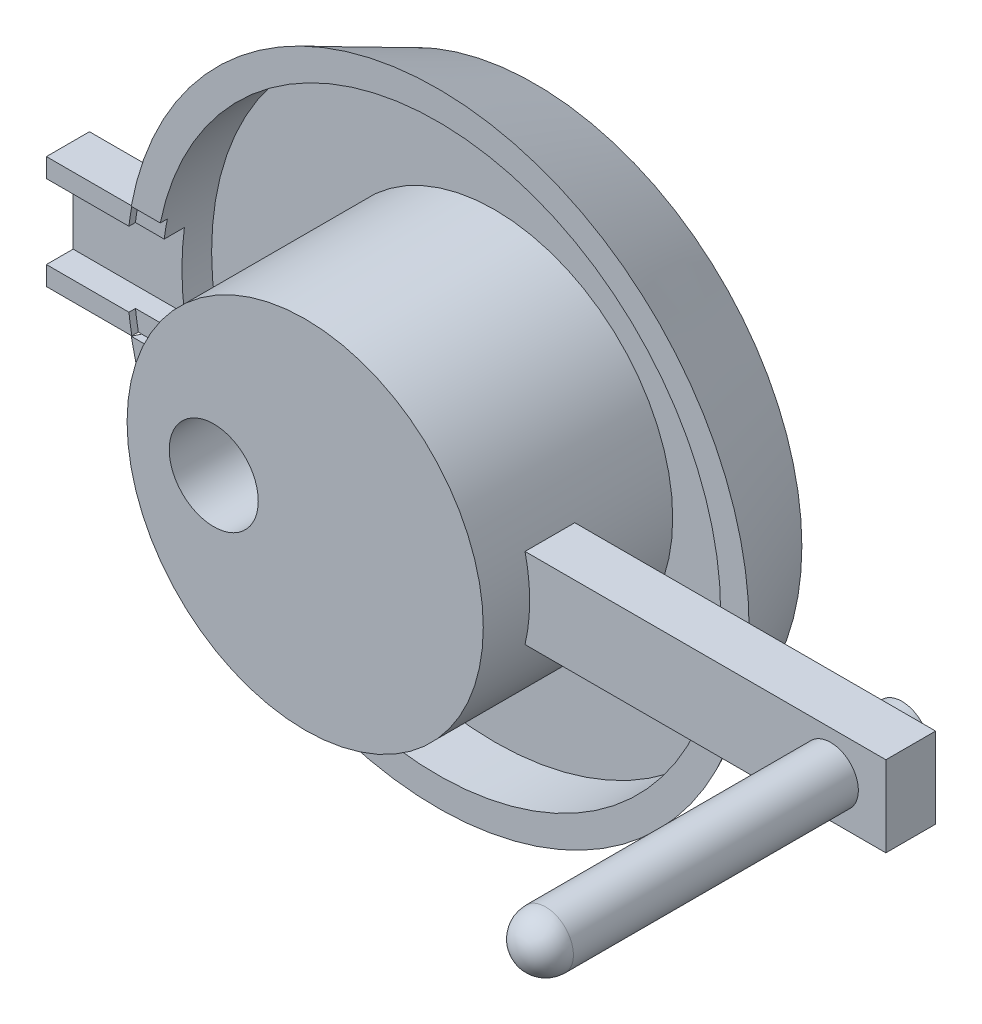
ISO-10303-21;
HEADER;
FILE_DESCRIPTION(('STEP AP214'),'2;1');
FILE_NAME('part.step','',(''),(''),'','','');
FILE_SCHEMA(('AUTOMOTIVE_DESIGN { 1 0 10303 214 1 1 1 1 }'));
ENDSEC;
DATA;
#1=APPLICATION_CONTEXT('core data for automotive mechanical design processes');
#2=APPLICATION_PROTOCOL_DEFINITION('international standard','automotive_design',2000,#1);
#3=PRODUCT_CONTEXT('',#1,'mechanical');
#4=PRODUCT('Part','Part','',(#3));
#5=PRODUCT_RELATED_PRODUCT_CATEGORY('part','',(#4));
#6=PRODUCT_DEFINITION_FORMATION('','',#4);
#7=PRODUCT_DEFINITION_CONTEXT('part definition',#1,'design');
#8=PRODUCT_DEFINITION('design','',#6,#7);
#9=PRODUCT_DEFINITION_SHAPE('','',#8);
#10=(LENGTH_UNIT() NAMED_UNIT(*) SI_UNIT(.MILLI.,.METRE.));
#11=(NAMED_UNIT(*) PLANE_ANGLE_UNIT() SI_UNIT($,.RADIAN.));
#12=(NAMED_UNIT(*) SI_UNIT($,.STERADIAN.) SOLID_ANGLE_UNIT());
#13=UNCERTAINTY_MEASURE_WITH_UNIT(LENGTH_MEASURE(1.E-05),#10,'distance_accuracy_value','');
#14=(GEOMETRIC_REPRESENTATION_CONTEXT(3) GLOBAL_UNCERTAINTY_ASSIGNED_CONTEXT((#13)) GLOBAL_UNIT_ASSIGNED_CONTEXT((#10,
#11,#12)) REPRESENTATION_CONTEXT('',''));
#15=CARTESIAN_POINT('',(0.,0.,0.));
#16=DIRECTION('',(0.,0.,1.));
#17=DIRECTION('',(1.,0.,0.));
#18=AXIS2_PLACEMENT_3D('',#15,#16,#17);
#19=CARTESIAN_POINT('',(-110.,15.8030060752015,-17.3472721621208));
#20=DIRECTION('',(0.,0.,-1.));
#21=DIRECTION('',(-1.,0.,0.));
#22=AXIS2_PLACEMENT_3D('',#19,#20,#21);
#23=PLANE('',#22);
#24=DIRECTION('',(1.,0.,0.));
#25=VECTOR('',#24,1.);
#26=CARTESIAN_POINT('',(-110.,10.4411316840622,-17.3472721621208));
#27=LINE('',#26,#25);
#28=CARTESIAN_POINT('',(-110.,10.4411316840622,-17.3472721621208));
#29=VERTEX_POINT('',#28);
#30=CARTESIAN_POINT('',(-86.8277278753882,10.4411316840622,-17.3472721621206));
#31=VERTEX_POINT('',#30);
#32=EDGE_CURVE('E369',#29,#31,#27,.T.);
#33=ORIENTED_EDGE('',*,*,#32,.T.);
#34=CARTESIAN_POINT('',(0.,0.,-17.34727216212));
#35=DIRECTION('',(0.,0.,-1.));
#36=DIRECTION('',(-1.,0.,0.));
#37=AXIS2_PLACEMENT_3D('',#34,#35,#36);
#38=CIRCLE('',#37,87.4532535635261);
#39=CARTESIAN_POINT('',(-86.0135835658155,15.8030060752015,-17.3472721621206));
#40=VERTEX_POINT('',#39);
#41=EDGE_CURVE('E249',#31,#40,#38,.T.);
#42=ORIENTED_EDGE('',*,*,#41,.T.);
#43=DIRECTION('',(1.,0.,0.));
#44=VECTOR('',#43,1.);
#45=CARTESIAN_POINT('',(-110.,15.8030060752015,-17.3472721621208));
#46=LINE('',#45,#44);
#47=CARTESIAN_POINT('',(-110.,15.8030060752015,-17.3472721621208));
#48=VERTEX_POINT('',#47);
#49=EDGE_CURVE('E423',#48,#40,#46,.T.);
#50=ORIENTED_EDGE('',*,*,#49,.F.);
#51=DIRECTION('',(0.,1.,0.));
#52=VECTOR('',#51,1.);
#53=CARTESIAN_POINT('',(-110.,15.8030060752015,-17.3472721621208));
#54=LINE('',#53,#52);
#55=EDGE_CURVE('E372',#29,#48,#54,.T.);
#56=ORIENTED_EDGE('',*,*,#55,.F.);
#57=EDGE_LOOP('',(#33,#42,#50,#56));
#58=FACE_BOUND('',#57,.T.);
#59=ADVANCED_FACE('F46',(#58),#23,.F.);
#60=CARTESIAN_POINT('',(0.,0.,-33.1783072477576));
#61=DIRECTION('',(0.,0.,1.));
#62=DIRECTION('',(1.,0.,0.));
#63=AXIS2_PLACEMENT_3D('',#60,#61,#62);
#64=CYLINDRICAL_SURFACE('',#63,79.4516873044254);
#65=CARTESIAN_POINT('',(0.,0.,-33.1783072477576));
#66=DIRECTION('',(0.,0.,1.));
#67=DIRECTION('',(1.,0.,0.));
#68=AXIS2_PLACEMENT_3D('',#65,#66,#67);
#69=CIRCLE('',#68,79.4516873044254);
#70=CARTESIAN_POINT('',(79.4516873044254,0.,-33.1783072477576));
#71=VERTEX_POINT('',#70);
#72=EDGE_CURVE('E432',#71,#71,#69,.T.);
#73=ORIENTED_EDGE('',*,*,#72,.F.);
#74=EDGE_LOOP('',(#73));
#75=FACE_BOUND('',#74,.T.);
#76=CARTESIAN_POINT('',(0.,0.,-19.1783072477576));
#77=DIRECTION('',(0.,0.,-1.));
#78=DIRECTION('',(1.,0.,0.));
#79=AXIS2_PLACEMENT_3D('',#76,#77,#78);
#80=CIRCLE('',#79,79.4516873044254);
#81=CARTESIAN_POINT('',(-77.863267306241,-15.8076633288115,-19.1783072477576));
#82=VERTEX_POINT('',#81);
#83=CARTESIAN_POINT('',(-78.7626395232934,-10.4411316840622,-19.1783072477576));
#84=VERTEX_POINT('',#83);
#85=EDGE_CURVE('E70',#82,#84,#80,.T.);
#86=ORIENTED_EDGE('',*,*,#85,.F.);
#87=DIRECTION('',(0.,0.,1.));
#88=VECTOR('',#87,1.);
#89=CARTESIAN_POINT('',(-77.863267306241,-15.8076633288115,-19.1783072477576));
#90=LINE('',#89,#88);
#91=CARTESIAN_POINT('',(-77.863267306241,-15.8076633288115,-17.1783072477576));
#92=VERTEX_POINT('',#91);
#93=EDGE_CURVE('E193',#82,#92,#90,.T.);
#94=ORIENTED_EDGE('',*,*,#93,.T.);
#95=CARTESIAN_POINT('',(0.,0.,-17.1783072477576));
#96=DIRECTION('',(0.,0.,1.));
#97=DIRECTION('',(1.,0.,0.));
#98=AXIS2_PLACEMENT_3D('',#95,#96,#97);
#99=CIRCLE('',#98,79.4516873044254);
#100=CARTESIAN_POINT('',(-77.863267306241,15.8076633288116,-17.1783072477576));
#101=VERTEX_POINT('',#100);
#102=EDGE_CURVE('E426',#92,#101,#99,.T.);
#103=ORIENTED_EDGE('',*,*,#102,.T.);
#104=DIRECTION('',(0.,0.,1.));
#105=VECTOR('',#104,1.);
#106=CARTESIAN_POINT('',(-77.863267306241,15.8076633288116,-19.1783072477576));
#107=LINE('',#106,#105);
#108=CARTESIAN_POINT('',(-77.863267306241,15.8076633288116,-19.1783072477576));
#109=VERTEX_POINT('',#108);
#110=EDGE_CURVE('E201',#109,#101,#107,.T.);
#111=ORIENTED_EDGE('',*,*,#110,.F.);
#112=CARTESIAN_POINT('',(-78.7626395232934,10.4411316840622,-19.1783072477576));
#113=VERTEX_POINT('',#112);
#114=EDGE_CURVE('E190',#113,#109,#80,.T.);
#115=ORIENTED_EDGE('',*,*,#114,.F.);
#116=DIRECTION('',(0.,0.,1.));
#117=VECTOR('',#116,1.);
#118=CARTESIAN_POINT('',(-78.7626395232934,10.4411316840622,-33.1783072477576));
#119=LINE('',#118,#117);
#120=CARTESIAN_POINT('',(-78.7626395232934,10.4411316840622,-24.8504417891901));
#121=VERTEX_POINT('',#120);
#122=EDGE_CURVE('E391',#121,#113,#119,.T.);
#123=ORIENTED_EDGE('',*,*,#122,.F.);
#124=CARTESIAN_POINT('',(0.,0.,-24.8504417891895));
#125=DIRECTION('',(0.,0.,-1.));
#126=DIRECTION('',(-1.,0.,0.));
#127=AXIS2_PLACEMENT_3D('',#124,#125,#126);
#128=CIRCLE('',#127,79.4516873044254);
#129=CARTESIAN_POINT('',(-78.7626395232934,-10.4411316840622,-24.8504417891901));
#130=VERTEX_POINT('',#129);
#131=EDGE_CURVE('E403',#130,#121,#128,.T.);
#132=ORIENTED_EDGE('',*,*,#131,.F.);
#133=DIRECTION('',(0.,0.,1.));
#134=VECTOR('',#133,1.);
#135=CARTESIAN_POINT('',(-78.7626395232934,-10.4411316840622,-33.1783072477576));
#136=LINE('',#135,#134);
#137=EDGE_CURVE('E207',#84,#130,#136,.F.);
#138=ORIENTED_EDGE('',*,*,#137,.F.);
#139=EDGE_LOOP('',(#86,#94,#103,#111,#115,#123,#132,#138));
#140=FACE_BOUND('',#139,.T.);
#141=ADVANCED_FACE('F205',(#75,#140),#64,.F.);
#142=CARTESIAN_POINT('',(0.,0.,-17.1783072477576));
#143=DIRECTION('',(0.,0.,1.));
#144=DIRECTION('',(1.,0.,0.));
#145=AXIS2_PLACEMENT_3D('',#142,#143,#144);
#146=CONICAL_SURFACE('',#145,87.4532535635261,0.429347341361167);
#147=CARTESIAN_POINT('',(-81.1707916499562,-15.8076633288115,-27.5697947471287));
#148=CARTESIAN_POINT('',(-81.9006412330142,-15.8076633288115,-26.0050437343717));
#149=CARTESIAN_POINT('',(-82.6301969309398,-15.8076633288115,-24.4401556633716));
#150=CARTESIAN_POINT('',(-84.0887619982068,-15.8076633288115,-21.3101251342316));
#151=CARTESIAN_POINT('',(-84.8177713676055,-15.8076633288115,-19.7449826761185));
#152=CARTESIAN_POINT('',(-86.2752853621597,-15.8076633288115,-16.6144627962403));
#153=CARTESIAN_POINT('',(-87.0037899873223,-15.8076633288115,-15.0490853744785));
#154=CARTESIAN_POINT('',(-88.4603302018703,-15.8076633288115,-11.9181121318984));
#155=CARTESIAN_POINT('',(-89.1883657912064,-15.8076633288115,-10.352516311057));
#156=CARTESIAN_POINT('',(-89.9161846352235,-15.8076633288115,-8.78681974838652));
#157=B_SPLINE_CURVE_WITH_KNOTS('',3,(#147,#148,#149,#150,#151,#152,#153,#154,#155,#156),
.UNSPECIFIED.,.F.,.F.,(4,2,2,2,4),(0.,5.17978134078667,10.359562138167,15.5393428612142,
20.7191241275354),.UNSPECIFIED.);
#158=CARTESIAN_POINT('',(-85.0815633442139,-15.8076633288115,-19.1783072477576));
#159=VERTEX_POINT('',#158);
#160=CARTESIAN_POINT('',(-86.0127277728671,-15.8076633288115,-17.1783072477576));
#161=VERTEX_POINT('',#160);
#162=EDGE_CURVE('E257',#159,#161,#157,.T.);
#163=ORIENTED_EDGE('',*,*,#162,.F.);
#164=CARTESIAN_POINT('',(0.,0.,-19.1783072477576));
#165=DIRECTION('',(0.,0.,1.));
#166=DIRECTION('',(1.,0.,0.));
#167=AXIS2_PLACEMENT_3D('',#164,#165,#166);
#168=CIRCLE('',#167,86.5375909129237);
#169=CARTESIAN_POINT('',(-85.0824285031855,-15.8030060752015,-19.1783072477576));
#170=VERTEX_POINT('',#169);
#171=EDGE_CURVE('E186',#159,#170,#168,.F.);
#172=ORIENTED_EDGE('',*,*,#171,.T.);
#173=CARTESIAN_POINT('',(-99.8671215940255,-15.8030060752015,12.6503066753599));
#174=CARTESIAN_POINT('',(-98.4733748466682,-15.8030060752015,9.64348997213781));
#175=CARTESIAN_POINT('',(-97.0790477456083,-15.8030060752015,6.63694234804403));
#176=CARTESIAN_POINT('',(-94.2890578783447,-15.8030060752015,0.62446670157915));
#177=CARTESIAN_POINT('',(-92.8933951120654,-15.8030060752015,-2.38146132075677));
#178=CARTESIAN_POINT('',(-88.7041468476065,-15.8030060752015,-11.3981809719123));
#179=CARTESIAN_POINT('',(-85.9082956647367,-15.8030060752015,-17.4079205267518));
#180=CARTESIAN_POINT('',(-81.7084767017977,-15.8030060752015,-26.4197181841688));
#181=CARTESIAN_POINT('',(-80.3075291751193,-15.8030060752015,-29.4231839222923));
#182=CARTESIAN_POINT('',(-77.503270175861,-15.8030060752015,-35.4290113736298));
#183=CARTESIAN_POINT('',(-76.0999587035228,-15.8030060752015,-38.4313730869566));
#184=CARTESIAN_POINT('',(-73.2905632650009,-15.8030060752015,-44.4348065809532));
#185=CARTESIAN_POINT('',(-71.8844792933504,-15.8030060752015,-47.4358783590653));
#186=CARTESIAN_POINT('',(-69.068989364936,-15.8030060752015,-53.4364644450023));
#187=CARTESIAN_POINT('',(-67.6595834069583,-15.8030060752015,-56.4359787522577));
#188=CARTESIAN_POINT('',(-66.2482408429435,-15.8030060752015,-59.4345824232532));
#189=B_SPLINE_CURVE_WITH_KNOTS('',3,(#173,#174,#175,#176,#177,#178,#179,#180,#181,#182,#183,
#184,#185,#186,#187,#188),.UNSPECIFIED.,.F.,.F.,(4,2,2,2,2,2,2,4),(0.,9.94239837863744,
19.8847973215241,39.7695543996393,49.7119448489661,59.6543342816516,69.5967433386337,
79.5391560293386),.UNSPECIFIED.);
#190=CARTESIAN_POINT('',(-80.3006091167539,-15.8030060752015,-29.4370035857726));
#191=VERTEX_POINT('',#190);
#192=EDGE_CURVE('E315',#170,#191,#189,.T.);
#193=ORIENTED_EDGE('',*,*,#192,.T.);
#194=CARTESIAN_POINT('',(2.61646719938933E-13,0.,-29.437003585772));
#195=DIRECTION('',(0.,0.,1.));
#196=DIRECTION('',(1.,0.,0.));
#197=AXIS2_PLACEMENT_3D('',#194,#195,#196);
#198=CIRCLE('',#197,81.8408383726279);
#199=CARTESIAN_POINT('',(-80.3006091167539,15.8030060752015,-29.4370035857726));
#200=VERTEX_POINT('',#199);
#201=EDGE_CURVE('E323',#191,#200,#198,.F.);
#202=ORIENTED_EDGE('',*,*,#201,.T.);
#203=CARTESIAN_POINT('',(-66.2482408429435,15.8030060752015,-59.4345824232532));
#204=CARTESIAN_POINT('',(-67.6595834069583,15.8030060752015,-56.4359787522578));
#205=CARTESIAN_POINT('',(-69.068989364936,15.8030060752015,-53.4364644450023));
#206=CARTESIAN_POINT('',(-71.8844792933504,15.8030060752015,-47.4358783590653));
#207=CARTESIAN_POINT('',(-73.2905632650009,15.8030060752015,-44.4348065809533));
#208=CARTESIAN_POINT('',(-76.0999587035228,15.8030060752015,-38.4313730869566));
#209=CARTESIAN_POINT('',(-77.503270175861,15.8030060752015,-35.4290113736298));
#210=CARTESIAN_POINT('',(-80.3075291751193,15.8030060752015,-29.4231839222923));
#211=CARTESIAN_POINT('',(-81.7084767017977,15.8030060752015,-26.4197181841688));
#212=CARTESIAN_POINT('',(-85.9082956647367,15.8030060752015,-17.4079205267518));
#213=CARTESIAN_POINT('',(-88.7041468476065,15.8030060752015,-11.3981809719123));
#214=CARTESIAN_POINT('',(-92.8933951120654,15.8030060752015,-2.38146132075678));
#215=CARTESIAN_POINT('',(-94.2890578783447,15.8030060752015,0.624466701579147));
#216=CARTESIAN_POINT('',(-97.0790477456083,15.8030060752015,6.63694234804403));
#217=CARTESIAN_POINT('',(-98.4733748466682,15.8030060752015,9.64348997213781));
#218=CARTESIAN_POINT('',(-99.8671215940255,15.8030060752015,12.6503066753599));
#219=B_SPLINE_CURVE_WITH_KNOTS('',3,(#203,#204,#205,#206,#207,#208,#209,#210,#211,#212,#213,
#214,#215,#216,#217,#218),.UNSPECIFIED.,.F.,.F.,(4,2,2,2,2,2,2,4),(0.,9.94241269070497,
19.884821747687,29.8272111803726,39.7696016296993,59.6543587078146,69.5967576507012,
79.5391560293386),.UNSPECIFIED.);
#220=CARTESIAN_POINT('',(-85.0824285031855,15.8030060752015,-19.1783072477576));
#221=VERTEX_POINT('',#220);
#222=EDGE_CURVE('E330',#200,#221,#219,.T.);
#223=ORIENTED_EDGE('',*,*,#222,.T.);
#224=CARTESIAN_POINT('',(-85.0815633442138,15.8076633288116,-19.1783072477576));
#225=VERTEX_POINT('',#224);
#226=EDGE_CURVE('E230',#221,#225,#168,.F.);
#227=ORIENTED_EDGE('',*,*,#226,.T.);
#228=CARTESIAN_POINT('',(-89.9161846352235,15.8076633288116,-8.78681974838651));
#229=CARTESIAN_POINT('',(-89.1883657912064,15.8076633288116,-10.352516311057));
#230=CARTESIAN_POINT('',(-88.4603302018703,15.8076633288116,-11.9181121318983));
#231=CARTESIAN_POINT('',(-87.0037899873223,15.8076633288116,-15.0490853744785));
#232=CARTESIAN_POINT('',(-86.2752853621596,15.8076633288116,-16.6144627962403));
#233=CARTESIAN_POINT('',(-84.8177713676055,15.8076633288116,-19.7449826761185));
#234=CARTESIAN_POINT('',(-84.0887619982068,15.8076633288116,-21.3101251342316));
#235=CARTESIAN_POINT('',(-82.6301969309397,15.8076633288116,-24.4401556633716));
#236=CARTESIAN_POINT('',(-81.9006412330141,15.8076633288116,-26.0050437343717));
#237=CARTESIAN_POINT('',(-81.1707916499562,15.8076633288116,-27.5697947471287));
#238=B_SPLINE_CURVE_WITH_KNOTS('',3,(#228,#229,#230,#231,#232,#233,#234,#235,#236,#237),
.UNSPECIFIED.,.F.,.F.,(4,2,2,2,4),(0.,5.17978126632115,10.3595619893684,15.5393427867487,
20.7191241275354),.UNSPECIFIED.);
#239=CARTESIAN_POINT('',(-86.0127277728671,15.8076633288116,-17.1783072477576));
#240=VERTEX_POINT('',#239);
#241=EDGE_CURVE('E266',#240,#225,#238,.T.);
#242=ORIENTED_EDGE('',*,*,#241,.F.);
#243=CARTESIAN_POINT('',(0.,0.,-17.1783072477576));
#244=DIRECTION('',(0.,0.,1.));
#245=DIRECTION('',(1.,0.,0.));
#246=AXIS2_PLACEMENT_3D('',#243,#244,#245);
#247=CIRCLE('',#246,87.4532535635261);
#248=EDGE_CURVE('E431',#161,#240,#247,.T.);
#249=ORIENTED_EDGE('',*,*,#248,.F.);
#250=EDGE_LOOP('',(#163,#172,#193,#202,#223,#227,#242,#249));
#251=FACE_BOUND('',#250,.T.);
#252=CARTESIAN_POINT('',(0.,0.,-44.4833931002388));
#253=DIRECTION('',(0.,0.,1.));
#254=DIRECTION('',(1.,0.,0.));
#255=AXIS2_PLACEMENT_3D('',#252,#253,#254);
#256=CIRCLE('',#255,74.9521299202214);
#257=CARTESIAN_POINT('',(74.9521299202214,0.,-44.4833931002388));
#258=VERTEX_POINT('',#257);
#259=EDGE_CURVE('E427',#258,#258,#256,.T.);
#260=ORIENTED_EDGE('',*,*,#259,.T.);
#261=EDGE_LOOP('',(#260));
#262=FACE_BOUND('',#261,.T.);
#263=ADVANCED_FACE('F273',(#251,#262),#146,.T.);
#264=CARTESIAN_POINT('',(0.,0.,20.));
#265=DIRECTION('',(0.,0.,-1.));
#266=DIRECTION('',(-1.,0.,0.));
#267=AXIS2_PLACEMENT_3D('',#264,#265,#266);
#268=CYLINDRICAL_SURFACE('',#267,50.);
#269=CARTESIAN_POINT('',(0.,0.,6.98006881312807));
#270=DIRECTION('',(0.,0.,1.));
#271=DIRECTION('',(1.,0.,0.));
#272=AXIS2_PLACEMENT_3D('',#269,#270,#271);
#273=CIRCLE('',#272,50.);
#274=CARTESIAN_POINT('',(48.7017135216553,-11.3200309210981,6.98006881312807));
#275=VERTEX_POINT('',#274);
#276=CARTESIAN_POINT('',(48.7017135216553,11.3200309210981,6.98006881312807));
#277=VERTEX_POINT('',#276);
#278=EDGE_CURVE('E492',#275,#277,#273,.T.);
#279=ORIENTED_EDGE('',*,*,#278,.T.);
#280=DIRECTION('',(0.,0.,-1.));
#281=VECTOR('',#280,1.);
#282=CARTESIAN_POINT('',(48.7017135216553,11.3200309210981,20.));
#283=LINE('',#282,#281);
#284=CARTESIAN_POINT('',(48.7017135216553,11.3200309210981,-6.98006881312807));
#285=VERTEX_POINT('',#284);
#286=EDGE_CURVE('E495',#277,#285,#283,.T.);
#287=ORIENTED_EDGE('',*,*,#286,.T.);
#288=CARTESIAN_POINT('',(0.,0.,-6.98006881312807));
#289=DIRECTION('',(0.,0.,-1.));
#290=DIRECTION('',(-1.,0.,0.));
#291=AXIS2_PLACEMENT_3D('',#288,#289,#290);
#292=CIRCLE('',#291,50.);
#293=CARTESIAN_POINT('',(48.7017135216553,-11.3200309210981,-6.98006881312807));
#294=VERTEX_POINT('',#293);
#295=EDGE_CURVE('E477',#285,#294,#292,.T.);
#296=ORIENTED_EDGE('',*,*,#295,.T.);
#297=DIRECTION('',(0.,0.,-1.));
#298=VECTOR('',#297,1.);
#299=CARTESIAN_POINT('',(48.7017135216553,-11.3200309210981,20.));
#300=LINE('',#299,#298);
#301=EDGE_CURVE('E488',#294,#275,#300,.F.);
#302=ORIENTED_EDGE('',*,*,#301,.T.);
#303=EDGE_LOOP('',(#279,#287,#296,#302));
#304=FACE_BOUND('',#303,.T.);
#305=CARTESIAN_POINT('',(0.,0.,20.));
#306=DIRECTION('',(0.,0.,1.));
#307=DIRECTION('',(1.,0.,0.));
#308=AXIS2_PLACEMENT_3D('',#305,#306,#307);
#309=CIRCLE('',#308,50.);
#310=CARTESIAN_POINT('',(50.,0.,20.));
#311=VERTEX_POINT('',#310);
#312=EDGE_CURVE('E503',#311,#311,#309,.T.);
#313=ORIENTED_EDGE('',*,*,#312,.F.);
#314=EDGE_LOOP('',(#313));
#315=FACE_BOUND('',#314,.T.);
#316=CARTESIAN_POINT('',(0.,0.,-33.1783072477576));
#317=DIRECTION('',(0.,0.,1.));
#318=DIRECTION('',(1.,0.,0.));
#319=AXIS2_PLACEMENT_3D('',#316,#317,#318);
#320=CIRCLE('',#319,50.);
#321=CARTESIAN_POINT('',(50.,0.,-33.1783072477576));
#322=VERTEX_POINT('',#321);
#323=EDGE_CURVE('E436',#322,#322,#320,.T.);
#324=ORIENTED_EDGE('',*,*,#323,.T.);
#325=EDGE_LOOP('',(#324));
#326=FACE_BOUND('',#325,.T.);
#327=ADVANCED_FACE('F48',(#304,#315,#326),#268,.T.);
#328=CARTESIAN_POINT('',(0.,0.,20.));
#329=DIRECTION('',(0.,0.,1.));
#330=DIRECTION('',(1.,0.,0.));
#331=AXIS2_PLACEMENT_3D('',#328,#329,#330);
#332=PLANE('',#331);
#333=CARTESIAN_POINT('',(-25.6735540912739,-0.852792880654117,20.));
#334=DIRECTION('',(0.,0.,1.));
#335=DIRECTION('',(1.,0.,0.));
#336=AXIS2_PLACEMENT_3D('',#333,#334,#335);
#337=CIRCLE('',#336,12.5);
#338=CARTESIAN_POINT('',(-13.1735540912739,-0.852792880654117,20.));
#339=VERTEX_POINT('',#338);
#340=EDGE_CURVE('E499',#339,#339,#337,.T.);
#341=ORIENTED_EDGE('',*,*,#340,.F.);
#342=EDGE_LOOP('',(#341));
#343=FACE_BOUND('',#342,.T.);
#344=ORIENTED_EDGE('',*,*,#312,.T.);
#345=EDGE_LOOP('',(#344));
#346=FACE_BOUND('',#345,.T.);
#347=ADVANCED_FACE('F536',(#343,#346),#332,.T.);
#348=CARTESIAN_POINT('',(-25.6735540912739,-0.852792880654117,-20.));
#349=DIRECTION('',(0.,0.,1.));
#350=DIRECTION('',(1.,0.,0.));
#351=AXIS2_PLACEMENT_3D('',#348,#349,#350);
#352=CYLINDRICAL_SURFACE('',#351,12.5);
#353=CARTESIAN_POINT('',(-25.6735540912739,-0.852792880654117,-17.1783072477576));
#354=DIRECTION('',(0.,0.,1.));
#355=DIRECTION('',(1.,0.,0.));
#356=AXIS2_PLACEMENT_3D('',#353,#354,#355);
#357=CIRCLE('',#356,12.5);
#358=CARTESIAN_POINT('',(-13.1735540912739,-0.852792880654117,-17.1783072477576));
#359=VERTEX_POINT('',#358);
#360=EDGE_CURVE('E325',#359,#359,#357,.F.);
#361=ORIENTED_EDGE('',*,*,#360,.T.);
#362=EDGE_LOOP('',(#361));
#363=FACE_BOUND('',#362,.T.);
#364=ORIENTED_EDGE('',*,*,#340,.T.);
#365=EDGE_LOOP('',(#364));
#366=FACE_BOUND('',#365,.T.);
#367=ADVANCED_FACE('F534',(#363,#366),#352,.F.);
#368=CARTESIAN_POINT('',(-50.001,11.3200309210981,6.98006881312807));
#369=DIRECTION('',(0.,1.,0.));
#370=DIRECTION('',(0.,0.,1.));
#371=AXIS2_PLACEMENT_3D('',#368,#369,#370);
#372=PLANE('',#371);
#373=DIRECTION('',(0.,0.,1.));
#374=VECTOR('',#373,1.);
#375=CARTESIAN_POINT('',(150.,11.3200309210981,6.98006881312807));
#376=LINE('',#375,#374);
#377=CARTESIAN_POINT('',(150.,11.3200309210981,-6.98006881312807));
#378=VERTEX_POINT('',#377);
#379=CARTESIAN_POINT('',(150.,11.3200309210981,6.98006881312807));
#380=VERTEX_POINT('',#379);
#381=EDGE_CURVE('E461',#378,#380,#376,.T.);
#382=ORIENTED_EDGE('',*,*,#381,.F.);
#383=DIRECTION('',(1.,0.,0.));
#384=VECTOR('',#383,1.);
#385=CARTESIAN_POINT('',(-50.001,11.3200309210981,-6.98006881312807));
#386=LINE('',#385,#384);
#387=EDGE_CURVE('E473',#285,#378,#386,.T.);
#388=ORIENTED_EDGE('',*,*,#387,.F.);
#389=ORIENTED_EDGE('',*,*,#286,.F.);
#390=DIRECTION('',(1.,0.,0.));
#391=VECTOR('',#390,1.);
#392=CARTESIAN_POINT('',(-50.001,11.3200309210981,6.98006881312807));
#393=LINE('',#392,#391);
#394=EDGE_CURVE('E481',#277,#380,#393,.T.);
#395=ORIENTED_EDGE('',*,*,#394,.T.);
#396=EDGE_LOOP('',(#382,#388,#389,#395));
#397=FACE_BOUND('',#396,.T.);
#398=ADVANCED_FACE('F532',(#397),#372,.T.);
#399=CARTESIAN_POINT('',(-50.001,11.3200309210981,6.98006881312807));
#400=DIRECTION('',(0.,0.,1.));
#401=DIRECTION('',(1.,0.,0.));
#402=AXIS2_PLACEMENT_3D('',#399,#400,#401);
#403=PLANE('',#402);
#404=ORIENTED_EDGE('',*,*,#394,.F.);
#405=ORIENTED_EDGE('',*,*,#278,.F.);
#406=DIRECTION('',(1.,0.,0.));
#407=VECTOR('',#406,1.);
#408=CARTESIAN_POINT('',(-50.001,-11.3200309210981,6.98006881312807));
#409=LINE('',#408,#407);
#410=CARTESIAN_POINT('',(150.,-11.3200309210981,6.98006881312807));
#411=VERTEX_POINT('',#410);
#412=EDGE_CURVE('E478',#275,#411,#409,.T.);
#413=ORIENTED_EDGE('',*,*,#412,.T.);
#414=DIRECTION('',(0.,-1.,0.));
#415=VECTOR('',#414,1.);
#416=CARTESIAN_POINT('',(150.,11.3200309210981,6.98006881312807));
#417=LINE('',#416,#415);
#418=EDGE_CURVE('E465',#380,#411,#417,.T.);
#419=ORIENTED_EDGE('',*,*,#418,.F.);
#420=EDGE_LOOP('',(#404,#405,#413,#419));
#421=FACE_BOUND('',#420,.T.);
#422=CARTESIAN_POINT('',(134.496533674868,0.,6.98006881312807));
#423=DIRECTION('',(0.,0.,1.));
#424=DIRECTION('',(1.,0.,0.));
#425=AXIS2_PLACEMENT_3D('',#422,#423,#424);
#426=CIRCLE('',#425,7.78232082625419);
#427=CARTESIAN_POINT('',(142.278854501122,0.,6.98006881312807));
#428=VERTEX_POINT('',#427);
#429=EDGE_CURVE('E324',#428,#428,#426,.T.);
#430=ORIENTED_EDGE('',*,*,#429,.F.);
#431=EDGE_LOOP('',(#430));
#432=FACE_BOUND('',#431,.T.);
#433=ADVANCED_FACE('F526',(#421,#432),#403,.T.);
#434=CARTESIAN_POINT('',(-50.001,-11.3200309210981,6.98006881312807));
#435=DIRECTION('',(0.,-1.,0.));
#436=DIRECTION('',(0.,0.,-1.));
#437=AXIS2_PLACEMENT_3D('',#434,#435,#436);
#438=PLANE('',#437);
#439=DIRECTION('',(0.,0.,-1.));
#440=VECTOR('',#439,1.);
#441=CARTESIAN_POINT('',(150.,-11.3200309210981,6.98006881312807));
#442=LINE('',#441,#440);
#443=CARTESIAN_POINT('',(150.,-11.3200309210981,-6.98006881312807));
#444=VERTEX_POINT('',#443);
#445=EDGE_CURVE('E469',#411,#444,#442,.T.);
#446=ORIENTED_EDGE('',*,*,#445,.F.);
#447=ORIENTED_EDGE('',*,*,#412,.F.);
#448=ORIENTED_EDGE('',*,*,#301,.F.);
#449=DIRECTION('',(1.,0.,0.));
#450=VECTOR('',#449,1.);
#451=CARTESIAN_POINT('',(-50.001,-11.3200309210981,-6.98006881312807));
#452=LINE('',#451,#450);
#453=EDGE_CURVE('E474',#294,#444,#452,.T.);
#454=ORIENTED_EDGE('',*,*,#453,.T.);
#455=EDGE_LOOP('',(#446,#447,#448,#454));
#456=FACE_BOUND('',#455,.T.);
#457=ADVANCED_FACE('F516',(#456),#438,.T.);
#458=CARTESIAN_POINT('',(-50.001,11.3200309210981,-6.98006881312807));
#459=DIRECTION('',(0.,0.,-1.));
#460=DIRECTION('',(-1.,0.,0.));
#461=AXIS2_PLACEMENT_3D('',#458,#459,#460);
#462=PLANE('',#461);
#463=ORIENTED_EDGE('',*,*,#453,.F.);
#464=ORIENTED_EDGE('',*,*,#295,.F.);
#465=ORIENTED_EDGE('',*,*,#387,.T.);
#466=DIRECTION('',(0.,1.,0.));
#467=VECTOR('',#466,1.);
#468=CARTESIAN_POINT('',(150.,11.3200309210981,-6.98006881312807));
#469=LINE('',#468,#467);
#470=EDGE_CURVE('E453',#444,#378,#469,.T.);
#471=ORIENTED_EDGE('',*,*,#470,.F.);
#472=EDGE_LOOP('',(#463,#464,#465,#471));
#473=FACE_BOUND('',#472,.T.);
#474=CARTESIAN_POINT('',(134.496533674868,0.,-6.98006881312807));
#475=DIRECTION('',(0.,0.,-1.));
#476=DIRECTION('',(-1.,0.,0.));
#477=AXIS2_PLACEMENT_3D('',#474,#475,#476);
#478=CIRCLE('',#477,7.78232082625419);
#479=CARTESIAN_POINT('',(126.714212848614,0.,-6.98006881312807));
#480=VERTEX_POINT('',#479);
#481=EDGE_CURVE('E457',#480,#480,#478,.T.);
#482=ORIENTED_EDGE('',*,*,#481,.F.);
#483=EDGE_LOOP('',(#482));
#484=FACE_BOUND('',#483,.T.);
#485=ADVANCED_FACE('F513',(#473,#484),#462,.T.);
#486=CARTESIAN_POINT('',(150.,0.,0.));
#487=DIRECTION('',(1.,0.,0.));
#488=DIRECTION('',(0.,0.,-1.));
#489=AXIS2_PLACEMENT_3D('',#486,#487,#488);
#490=PLANE('',#489);
#491=ORIENTED_EDGE('',*,*,#470,.T.);
#492=ORIENTED_EDGE('',*,*,#381,.T.);
#493=ORIENTED_EDGE('',*,*,#418,.T.);
#494=ORIENTED_EDGE('',*,*,#445,.T.);
#495=EDGE_LOOP('',(#491,#492,#493,#494));
#496=FACE_BOUND('',#495,.T.);
#497=ADVANCED_FACE('F515',(#496),#490,.T.);
#498=CARTESIAN_POINT('',(134.496533674868,0.,-13.0199311868719));
#499=DIRECTION('',(0.,0.,1.));
#500=DIRECTION('',(1.,0.,0.));
#501=AXIS2_PLACEMENT_3D('',#498,#499,#500);
#502=PLANE('',#501);
#503=CARTESIAN_POINT('',(134.496533674868,0.,-13.0199311868719));
#504=DIRECTION('',(0.,0.,1.));
#505=DIRECTION('',(1.,0.,0.));
#506=AXIS2_PLACEMENT_3D('',#503,#504,#505);
#507=CIRCLE('',#506,7.78232082625419);
#508=CARTESIAN_POINT('',(142.278854501122,0.,-13.0199311868719));
#509=VERTEX_POINT('',#508);
#510=EDGE_CURVE('E449',#509,#509,#507,.T.);
#511=ORIENTED_EDGE('',*,*,#510,.F.);
#512=EDGE_LOOP('',(#511));
#513=FACE_BOUND('',#512,.T.);
#514=ADVANCED_FACE('F523',(#513),#502,.F.);
#515=CARTESIAN_POINT('',(134.496533674868,0.,-13.0199311868719));
#516=DIRECTION('',(0.,0.,1.));
#517=DIRECTION('',(1.,0.,0.));
#518=AXIS2_PLACEMENT_3D('',#515,#516,#517);
#519=CYLINDRICAL_SURFACE('',#518,7.78232082625419);
#520=ORIENTED_EDGE('',*,*,#481,.T.);
#521=EDGE_LOOP('',(#520));
#522=FACE_BOUND('',#521,.T.);
#523=ORIENTED_EDGE('',*,*,#510,.T.);
#524=EDGE_LOOP('',(#523));
#525=FACE_BOUND('',#524,.T.);
#526=ADVANCED_FACE('F510',(#522,#525),#519,.T.);
#527=ORIENTED_EDGE('',*,*,#429,.T.);
#528=EDGE_LOOP('',(#527));
#529=FACE_BOUND('',#528,.T.);
#530=CARTESIAN_POINT('',(134.496533674868,0.,86.9800688131281));
#531=DIRECTION('',(0.,0.,1.));
#532=DIRECTION('',(1.,0.,0.));
#533=AXIS2_PLACEMENT_3D('',#530,#531,#532);
#534=CIRCLE('',#533,7.78232082625419);
#535=CARTESIAN_POINT('',(142.278854501122,0.,86.9800688131281));
#536=VERTEX_POINT('',#535);
#537=EDGE_CURVE('E445',#536,#536,#534,.T.);
#538=ORIENTED_EDGE('',*,*,#537,.F.);
#539=EDGE_LOOP('',(#538));
#540=FACE_BOUND('',#539,.T.);
#541=ADVANCED_FACE('F571',(#529,#540),#519,.T.);
#542=CARTESIAN_POINT('',(134.496533674868,0.,86.9800688131281));
#543=DIRECTION('',(-1.,0.,0.));
#544=DIRECTION('',(0.,1.,0.));
#545=AXIS2_PLACEMENT_3D('',#542,#543,#544);
#546=SPHERICAL_SURFACE('',#545,7.78232082625419);
#547=CARTESIAN_POINT('',(134.496533674868,0.,86.9800688131281));
#548=DIRECTION('',(0.,0.,1.));
#549=DIRECTION('',(1.,0.,0.));
#550=AXIS2_PLACEMENT_3D('',#547,#548,#549);
#551=SPHERICAL_SURFACE('',#550,7.78232082625419);
#552=ORIENTED_EDGE('',*,*,#537,.T.);
#553=EDGE_LOOP('',(#552));
#554=FACE_BOUND('',#553,.T.);
#555=ADVANCED_FACE('F574',(#554),#551,.T.);
#556=CARTESIAN_POINT('',(0.,0.,-17.1783072477576));
#557=DIRECTION('',(0.,0.,1.));
#558=DIRECTION('',(1.,0.,0.));
#559=AXIS2_PLACEMENT_3D('',#556,#557,#558);
#560=PLANE('',#559);
#561=ORIENTED_EDGE('',*,*,#360,.F.);
#562=EDGE_LOOP('',(#561));
#563=FACE_BOUND('',#562,.T.);
#564=ADVANCED_FACE('F356',(#563),#560,.T.);
#565=CARTESIAN_POINT('',(0.,0.,-33.1783072477576));
#566=DIRECTION('',(0.,0.,1.));
#567=DIRECTION('',(1.,0.,0.));
#568=AXIS2_PLACEMENT_3D('',#565,#566,#567);
#569=PLANE('',#568);
#570=ORIENTED_EDGE('',*,*,#72,.T.);
#571=EDGE_LOOP('',(#570));
#572=FACE_BOUND('',#571,.T.);
#573=ORIENTED_EDGE('',*,*,#323,.F.);
#574=EDGE_LOOP('',(#573));
#575=FACE_BOUND('',#574,.T.);
#576=ADVANCED_FACE('F349',(#572,#575),#569,.T.);
#577=CARTESIAN_POINT('',(0.,0.,-44.4833931002388));
#578=DIRECTION('',(0.,0.,-1.));
#579=DIRECTION('',(-1.,0.,0.));
#580=AXIS2_PLACEMENT_3D('',#577,#578,#579);
#581=PLANE('',#580);
#582=ORIENTED_EDGE('',*,*,#259,.F.);
#583=EDGE_LOOP('',(#582));
#584=FACE_BOUND('',#583,.T.);
#585=ADVANCED_FACE('F347',(#584),#581,.T.);
#586=CARTESIAN_POINT('',(87.4532535635261,0.,-17.1783072477576));
#587=DIRECTION('',(0.,0.,1.));
#588=DIRECTION('',(1.,0.,0.));
#589=AXIS2_PLACEMENT_3D('',#586,#587,#588);
#590=PLANE('',#589);
#591=DIRECTION('',(-1.,0.,0.));
#592=VECTOR('',#591,1.);
#593=CARTESIAN_POINT('',(-86.0127277728671,15.8076633288116,-17.1783072477576));
#594=LINE('',#593,#592);
#595=EDGE_CURVE('E218',#101,#240,#594,.T.);
#596=ORIENTED_EDGE('',*,*,#595,.F.);
#597=ORIENTED_EDGE('',*,*,#102,.F.);
#598=DIRECTION('',(1.,0.,0.));
#599=VECTOR('',#598,1.);
#600=CARTESIAN_POINT('',(-86.0127277728671,-15.8076633288115,-17.1783072477576));
#601=LINE('',#600,#599);
#602=EDGE_CURVE('E196',#161,#92,#601,.T.);
#603=ORIENTED_EDGE('',*,*,#602,.F.);
#604=ORIENTED_EDGE('',*,*,#248,.T.);
#605=EDGE_LOOP('',(#596,#597,#603,#604));
#606=FACE_BOUND('',#605,.T.);
#607=ADVANCED_FACE('F306',(#606),#590,.T.);
#608=CARTESIAN_POINT('',(-110.,0.,-7.96828653441522E-13));
#609=DIRECTION('',(-1.,0.,0.));
#610=DIRECTION('',(0.,0.,1.));
#611=AXIS2_PLACEMENT_3D('',#608,#609,#610);
#612=PLANE('',#611);
#613=DIRECTION('',(0.,0.,-1.));
#614=VECTOR('',#613,1.);
#615=CARTESIAN_POINT('',(-110.,10.4411316840622,-24.8504417891903));
#616=LINE('',#615,#614);
#617=CARTESIAN_POINT('',(-110.,10.4411316840622,-24.8504417891903));
#618=VERTEX_POINT('',#617);
#619=EDGE_CURVE('E937',#29,#618,#616,.T.);
#620=ORIENTED_EDGE('',*,*,#619,.F.);
#621=ORIENTED_EDGE('',*,*,#55,.T.);
#622=DIRECTION('',(0.,0.,-1.));
#623=VECTOR('',#622,1.);
#624=CARTESIAN_POINT('',(-110.,15.8030060752015,-29.4370035857728));
#625=LINE('',#624,#623);
#626=CARTESIAN_POINT('',(-110.,15.8030060752015,-29.4370035857728));
#627=VERTEX_POINT('',#626);
#628=EDGE_CURVE('E397',#48,#627,#625,.T.);
#629=ORIENTED_EDGE('',*,*,#628,.T.);
#630=DIRECTION('',(0.,-1.,0.));
#631=VECTOR('',#630,1.);
#632=CARTESIAN_POINT('',(-110.,15.8030060752015,-29.4370035857728));
#633=LINE('',#632,#631);
#634=CARTESIAN_POINT('',(-110.,-15.8030060752015,-29.4370035857728));
#635=VERTEX_POINT('',#634);
#636=EDGE_CURVE('E401',#627,#635,#633,.T.);
#637=ORIENTED_EDGE('',*,*,#636,.T.);
#638=DIRECTION('',(0.,0.,1.));
#639=VECTOR('',#638,1.);
#640=CARTESIAN_POINT('',(-110.,-15.8030060752015,-29.4370035857728));
#641=LINE('',#640,#639);
#642=CARTESIAN_POINT('',(-110.,-15.8030060752015,-17.3472721621208));
#643=VERTEX_POINT('',#642);
#644=EDGE_CURVE('E394',#635,#643,#641,.T.);
#645=ORIENTED_EDGE('',*,*,#644,.T.);
#646=CARTESIAN_POINT('',(-110.,-10.4411316840622,-17.3472721621208));
#647=VERTEX_POINT('',#646);
#648=EDGE_CURVE('E383',#643,#647,#54,.T.);
#649=ORIENTED_EDGE('',*,*,#648,.T.);
#650=DIRECTION('',(0.,0.,1.));
#651=VECTOR('',#650,1.);
#652=CARTESIAN_POINT('',(-110.,-10.4411316840622,-24.8504417891903));
#653=LINE('',#652,#651);
#654=CARTESIAN_POINT('',(-110.,-10.4411316840622,-24.8504417891903));
#655=VERTEX_POINT('',#654);
#656=EDGE_CURVE('E385',#655,#647,#653,.T.);
#657=ORIENTED_EDGE('',*,*,#656,.F.);
#658=DIRECTION('',(0.,-1.,0.));
#659=VECTOR('',#658,1.);
#660=CARTESIAN_POINT('',(-110.,10.4411316840622,-24.8504417891903));
#661=LINE('',#660,#659);
#662=EDGE_CURVE('E392',#618,#655,#661,.T.);
#663=ORIENTED_EDGE('',*,*,#662,.F.);
#664=EDGE_LOOP('',(#620,#621,#629,#637,#645,#649,#657,#663));
#665=FACE_BOUND('',#664,.T.);
#666=ADVANCED_FACE('F302',(#665),#612,.T.);
#667=CARTESIAN_POINT('',(-110.,-15.8030060752015,-29.4370035857728));
#668=DIRECTION('',(0.,1.,0.));
#669=DIRECTION('',(0.,0.,1.));
#670=AXIS2_PLACEMENT_3D('',#667,#668,#669);
#671=PLANE('',#670);
#672=DIRECTION('',(1.,0.,0.));
#673=VECTOR('',#672,1.);
#674=CARTESIAN_POINT('',(-110.,-15.8030060752015,-19.1783072477576));
#675=LINE('',#674,#673);
#676=CARTESIAN_POINT('',(-86.0135835658155,-15.8030060752015,-19.1783072477576));
#677=VERTEX_POINT('',#676);
#678=EDGE_CURVE('E234',#677,#170,#675,.T.);
#679=ORIENTED_EDGE('',*,*,#678,.F.);
#680=DIRECTION('',(0.,0.,1.));
#681=VECTOR('',#680,1.);
#682=CARTESIAN_POINT('',(-86.0135835658155,-15.8030060752015,-19.1783072477576));
#683=LINE('',#682,#681);
#684=CARTESIAN_POINT('',(-86.0135835658155,-15.8030060752015,-17.3472721621206));
#685=VERTEX_POINT('',#684);
#686=EDGE_CURVE('E241',#677,#685,#683,.T.);
#687=ORIENTED_EDGE('',*,*,#686,.T.);
#688=DIRECTION('',(1.,0.,0.));
#689=VECTOR('',#688,1.);
#690=CARTESIAN_POINT('',(-110.,-15.8030060752015,-17.3472721621208));
#691=LINE('',#690,#689);
#692=EDGE_CURVE('E412',#643,#685,#691,.T.);
#693=ORIENTED_EDGE('',*,*,#692,.F.);
#694=ORIENTED_EDGE('',*,*,#644,.F.);
#695=DIRECTION('',(1.,0.,0.));
#696=VECTOR('',#695,1.);
#697=CARTESIAN_POINT('',(-110.,-15.8030060752015,-29.4370035857728));
#698=LINE('',#697,#696);
#699=EDGE_CURVE('E415',#635,#191,#698,.T.);
#700=ORIENTED_EDGE('',*,*,#699,.T.);
#701=ORIENTED_EDGE('',*,*,#192,.F.);
#702=EDGE_LOOP('',(#679,#687,#693,#694,#700,#701));
#703=FACE_BOUND('',#702,.T.);
#704=ADVANCED_FACE('F305',(#703),#671,.F.);
#705=CARTESIAN_POINT('',(-110.,15.8030060752015,-29.4370035857728));
#706=DIRECTION('',(0.,0.,1.));
#707=DIRECTION('',(1.,0.,0.));
#708=AXIS2_PLACEMENT_3D('',#705,#706,#707);
#709=PLANE('',#708);
#710=ORIENTED_EDGE('',*,*,#201,.F.);
#711=ORIENTED_EDGE('',*,*,#699,.F.);
#712=ORIENTED_EDGE('',*,*,#636,.F.);
#713=DIRECTION('',(1.,0.,0.));
#714=VECTOR('',#713,1.);
#715=CARTESIAN_POINT('',(-110.,15.8030060752015,-29.4370035857728));
#716=LINE('',#715,#714);
#717=EDGE_CURVE('E419',#627,#200,#716,.T.);
#718=ORIENTED_EDGE('',*,*,#717,.T.);
#719=EDGE_LOOP('',(#710,#711,#712,#718));
#720=FACE_BOUND('',#719,.T.);
#721=ADVANCED_FACE('F311',(#720),#709,.F.);
#722=CARTESIAN_POINT('',(-110.,15.8030060752015,-29.4370035857728));
#723=DIRECTION('',(0.,-1.,0.));
#724=DIRECTION('',(0.,0.,-1.));
#725=AXIS2_PLACEMENT_3D('',#722,#723,#724);
#726=PLANE('',#725);
#727=ORIENTED_EDGE('',*,*,#49,.T.);
#728=DIRECTION('',(0.,0.,1.));
#729=VECTOR('',#728,1.);
#730=CARTESIAN_POINT('',(-86.0135835658155,15.8030060752015,-19.1783072477576));
#731=LINE('',#730,#729);
#732=CARTESIAN_POINT('',(-86.0135835658155,15.8030060752015,-19.1783072477576));
#733=VERTEX_POINT('',#732);
#734=EDGE_CURVE('E253',#40,#733,#731,.F.);
#735=ORIENTED_EDGE('',*,*,#734,.T.);
#736=DIRECTION('',(-1.,0.,0.));
#737=VECTOR('',#736,1.);
#738=CARTESIAN_POINT('',(-110.,15.8030060752015,-19.1783072477576));
#739=LINE('',#738,#737);
#740=EDGE_CURVE('E227',#221,#733,#739,.T.);
#741=ORIENTED_EDGE('',*,*,#740,.F.);
#742=ORIENTED_EDGE('',*,*,#222,.F.);
#743=ORIENTED_EDGE('',*,*,#717,.F.);
#744=ORIENTED_EDGE('',*,*,#628,.F.);
#745=EDGE_LOOP('',(#727,#735,#741,#742,#743,#744));
#746=FACE_BOUND('',#745,.T.);
#747=ADVANCED_FACE('F340',(#746),#726,.F.);
#748=ORIENTED_EDGE('',*,*,#692,.T.);
#749=CARTESIAN_POINT('',(0.,0.,-17.34727216212));
#750=DIRECTION('',(0.,0.,-1.));
#751=DIRECTION('',(-1.,0.,0.));
#752=AXIS2_PLACEMENT_3D('',#749,#750,#751);
#753=CIRCLE('',#752,87.4532535635261);
#754=CARTESIAN_POINT('',(-86.8277278753882,-10.4411316840622,-17.3472721621206));
#755=VERTEX_POINT('',#754);
#756=EDGE_CURVE('E237',#685,#755,#753,.T.);
#757=ORIENTED_EDGE('',*,*,#756,.T.);
#758=DIRECTION('',(-1.,0.,0.));
#759=VECTOR('',#758,1.);
#760=CARTESIAN_POINT('',(-110.,-10.4411316840622,-17.3472721621208));
#761=LINE('',#760,#759);
#762=EDGE_CURVE('E338',#755,#647,#761,.T.);
#763=ORIENTED_EDGE('',*,*,#762,.T.);
#764=ORIENTED_EDGE('',*,*,#648,.F.);
#765=EDGE_LOOP('',(#748,#757,#763,#764));
#766=FACE_BOUND('',#765,.T.);
#767=ADVANCED_FACE('F293',(#766),#23,.F.);
#768=CARTESIAN_POINT('',(150.001000000001,10.4411316840622,-24.8504417891884));
#769=DIRECTION('',(0.,1.,0.));
#770=DIRECTION('',(0.,0.,1.));
#771=AXIS2_PLACEMENT_3D('',#768,#769,#770);
#772=PLANE('',#771);
#773=DIRECTION('',(1.,0.,0.));
#774=VECTOR('',#773,1.);
#775=CARTESIAN_POINT('',(150.001000000001,10.4411316840622,-19.1783072477576));
#776=LINE('',#775,#774);
#777=CARTESIAN_POINT('',(-86.8277278753882,10.4411316840622,-19.1783072477576));
#778=VERTEX_POINT('',#777);
#779=EDGE_CURVE('E223',#778,#113,#776,.T.);
#780=ORIENTED_EDGE('',*,*,#779,.F.);
#781=DIRECTION('',(0.,0.,1.));
#782=VECTOR('',#781,1.);
#783=CARTESIAN_POINT('',(-86.8277278753882,10.4411316840622,-19.1783072477576));
#784=LINE('',#783,#782);
#785=EDGE_CURVE('E245',#778,#31,#784,.T.);
#786=ORIENTED_EDGE('',*,*,#785,.T.);
#787=ORIENTED_EDGE('',*,*,#32,.F.);
#788=ORIENTED_EDGE('',*,*,#619,.T.);
#789=DIRECTION('',(-1.,0.,0.));
#790=VECTOR('',#789,1.);
#791=CARTESIAN_POINT('',(150.001000000001,10.4411316840622,-24.8504417891884));
#792=LINE('',#791,#790);
#793=EDGE_CURVE('E405',#121,#618,#792,.T.);
#794=ORIENTED_EDGE('',*,*,#793,.F.);
#795=ORIENTED_EDGE('',*,*,#122,.T.);
#796=EDGE_LOOP('',(#780,#786,#787,#788,#794,#795));
#797=FACE_BOUND('',#796,.T.);
#798=ADVANCED_FACE('F289',(#797),#772,.F.);
#799=CARTESIAN_POINT('',(150.001000000001,-10.4411316840622,-24.8504417891884));
#800=DIRECTION('',(0.,-1.,0.));
#801=DIRECTION('',(0.,0.,-1.));
#802=AXIS2_PLACEMENT_3D('',#799,#800,#801);
#803=PLANE('',#802);
#804=ORIENTED_EDGE('',*,*,#762,.F.);
#805=DIRECTION('',(0.,0.,1.));
#806=VECTOR('',#805,1.);
#807=CARTESIAN_POINT('',(-86.8277278753882,-10.4411316840622,-19.1783072477576));
#808=LINE('',#807,#806);
#809=CARTESIAN_POINT('',(-86.8277278753882,-10.4411316840622,-19.1783072477576));
#810=VERTEX_POINT('',#809);
#811=EDGE_CURVE('E11',#755,#810,#808,.F.);
#812=ORIENTED_EDGE('',*,*,#811,.T.);
#813=DIRECTION('',(-1.,0.,0.));
#814=VECTOR('',#813,1.);
#815=CARTESIAN_POINT('',(150.001000000001,-10.4411316840622,-19.1783072477576));
#816=LINE('',#815,#814);
#817=EDGE_CURVE('E55',#84,#810,#816,.T.);
#818=ORIENTED_EDGE('',*,*,#817,.F.);
#819=ORIENTED_EDGE('',*,*,#137,.T.);
#820=DIRECTION('',(-1.,0.,0.));
#821=VECTOR('',#820,1.);
#822=CARTESIAN_POINT('',(150.001000000001,-10.4411316840622,-24.8504417891884));
#823=LINE('',#822,#821);
#824=EDGE_CURVE('E387',#130,#655,#823,.T.);
#825=ORIENTED_EDGE('',*,*,#824,.T.);
#826=ORIENTED_EDGE('',*,*,#656,.T.);
#827=EDGE_LOOP('',(#804,#812,#818,#819,#825,#826));
#828=FACE_BOUND('',#827,.T.);
#829=ADVANCED_FACE('F292',(#828),#803,.F.);
#830=CARTESIAN_POINT('',(150.001000000001,10.4411316840622,-24.8504417891884));
#831=DIRECTION('',(0.,0.,-1.));
#832=DIRECTION('',(-1.,0.,0.));
#833=AXIS2_PLACEMENT_3D('',#830,#831,#832);
#834=PLANE('',#833);
#835=ORIENTED_EDGE('',*,*,#131,.T.);
#836=ORIENTED_EDGE('',*,*,#793,.T.);
#837=ORIENTED_EDGE('',*,*,#662,.T.);
#838=ORIENTED_EDGE('',*,*,#824,.F.);
#839=EDGE_LOOP('',(#835,#836,#837,#838));
#840=FACE_BOUND('',#839,.T.);
#841=ADVANCED_FACE('F295',(#840),#834,.F.);
#842=CARTESIAN_POINT('',(0.,0.,-19.1783072477576));
#843=DIRECTION('',(0.,0.,1.));
#844=DIRECTION('',(1.,0.,0.));
#845=AXIS2_PLACEMENT_3D('',#842,#843,#844);
#846=PLANE('',#845);
#847=DIRECTION('',(1.,0.,0.));
#848=VECTOR('',#847,1.);
#849=CARTESIAN_POINT('',(-86.0127277728671,-15.8076633288115,-19.1783072477576));
#850=LINE('',#849,#848);
#851=EDGE_CURVE('E182',#159,#82,#850,.T.);
#852=ORIENTED_EDGE('',*,*,#851,.T.);
#853=ORIENTED_EDGE('',*,*,#85,.T.);
#854=ORIENTED_EDGE('',*,*,#817,.T.);
#855=CARTESIAN_POINT('',(0.,0.,-19.1783072477576));
#856=DIRECTION('',(0.,0.,1.));
#857=DIRECTION('',(1.,0.,0.));
#858=AXIS2_PLACEMENT_3D('',#855,#856,#857);
#859=CIRCLE('',#858,87.4532535635261);
#860=EDGE_CURVE('E221',#810,#677,#859,.T.);
#861=ORIENTED_EDGE('',*,*,#860,.T.);
#862=ORIENTED_EDGE('',*,*,#678,.T.);
#863=ORIENTED_EDGE('',*,*,#171,.F.);
#864=EDGE_LOOP('',(#852,#853,#854,#861,#862,#863));
#865=FACE_BOUND('',#864,.T.);
#866=ADVANCED_FACE('F184',(#865),#846,.T.);
#867=CARTESIAN_POINT('',(0.,0.,-19.1783072477576));
#868=DIRECTION('',(0.,0.,1.));
#869=DIRECTION('',(1.,0.,0.));
#870=AXIS2_PLACEMENT_3D('',#867,#868,#869);
#871=CYLINDRICAL_SURFACE('',#870,87.4532535635261);
#872=ORIENTED_EDGE('',*,*,#860,.F.);
#873=ORIENTED_EDGE('',*,*,#811,.F.);
#874=ORIENTED_EDGE('',*,*,#756,.F.);
#875=ORIENTED_EDGE('',*,*,#686,.F.);
#876=EDGE_LOOP('',(#872,#873,#874,#875));
#877=FACE_BOUND('',#876,.T.);
#878=ADVANCED_FACE('F281',(#877),#871,.F.);
#879=CARTESIAN_POINT('',(-86.0127277728671,-15.8076633288115,-19.1783072477576));
#880=DIRECTION('',(0.,-1.,0.));
#881=DIRECTION('',(0.,0.,-1.));
#882=AXIS2_PLACEMENT_3D('',#879,#880,#881);
#883=PLANE('',#882);
#884=ORIENTED_EDGE('',*,*,#162,.T.);
#885=ORIENTED_EDGE('',*,*,#602,.T.);
#886=ORIENTED_EDGE('',*,*,#93,.F.);
#887=ORIENTED_EDGE('',*,*,#851,.F.);
#888=EDGE_LOOP('',(#884,#885,#886,#887));
#889=FACE_BOUND('',#888,.T.);
#890=ADVANCED_FACE('F194',(#889),#883,.F.);
#891=ORIENTED_EDGE('',*,*,#41,.F.);
#892=ORIENTED_EDGE('',*,*,#785,.F.);
#893=EDGE_CURVE('E62',#733,#778,#859,.T.);
#894=ORIENTED_EDGE('',*,*,#893,.F.);
#895=ORIENTED_EDGE('',*,*,#734,.F.);
#896=EDGE_LOOP('',(#891,#892,#894,#895));
#897=FACE_BOUND('',#896,.T.);
#898=ADVANCED_FACE('F280',(#897),#871,.F.);
#899=ORIENTED_EDGE('',*,*,#740,.T.);
#900=ORIENTED_EDGE('',*,*,#893,.T.);
#901=ORIENTED_EDGE('',*,*,#779,.T.);
#902=ORIENTED_EDGE('',*,*,#114,.T.);
#903=DIRECTION('',(-1.,0.,0.));
#904=VECTOR('',#903,1.);
#905=CARTESIAN_POINT('',(-86.0127277728671,15.8076633288116,-19.1783072477576));
#906=LINE('',#905,#904);
#907=EDGE_CURVE('E202',#109,#225,#906,.T.);
#908=ORIENTED_EDGE('',*,*,#907,.T.);
#909=ORIENTED_EDGE('',*,*,#226,.F.);
#910=EDGE_LOOP('',(#899,#900,#901,#902,#908,#909));
#911=FACE_BOUND('',#910,.T.);
#912=ADVANCED_FACE('F287',(#911),#846,.T.);
#913=CARTESIAN_POINT('',(-86.0127277728671,15.8076633288116,-19.1783072477576));
#914=DIRECTION('',(0.,1.,0.));
#915=DIRECTION('',(0.,0.,1.));
#916=AXIS2_PLACEMENT_3D('',#913,#914,#915);
#917=PLANE('',#916);
#918=ORIENTED_EDGE('',*,*,#241,.T.);
#919=ORIENTED_EDGE('',*,*,#907,.F.);
#920=ORIENTED_EDGE('',*,*,#110,.T.);
#921=ORIENTED_EDGE('',*,*,#595,.T.);
#922=EDGE_LOOP('',(#918,#919,#920,#921));
#923=FACE_BOUND('',#922,.T.);
#924=ADVANCED_FACE('F282',(#923),#917,.F.);
#925=CLOSED_SHELL('',(#59,#141,#263,#327,#347,#367,#398,#433,#457,#485,#497,#514,#526,#541,#555,
#564,#576,#585,#607,#666,#704,#721,#747,#767,#798,#829,#841,#866,#878,#890,#898,#912,#924));
#926=MANIFOLD_SOLID_BREP('B2',#925);
#927=ADVANCED_BREP_SHAPE_REPRESENTATION('',(#18,#926),#14);
#928=SHAPE_DEFINITION_REPRESENTATION(#9,#927);
ENDSEC;
END-ISO-10303-21;
